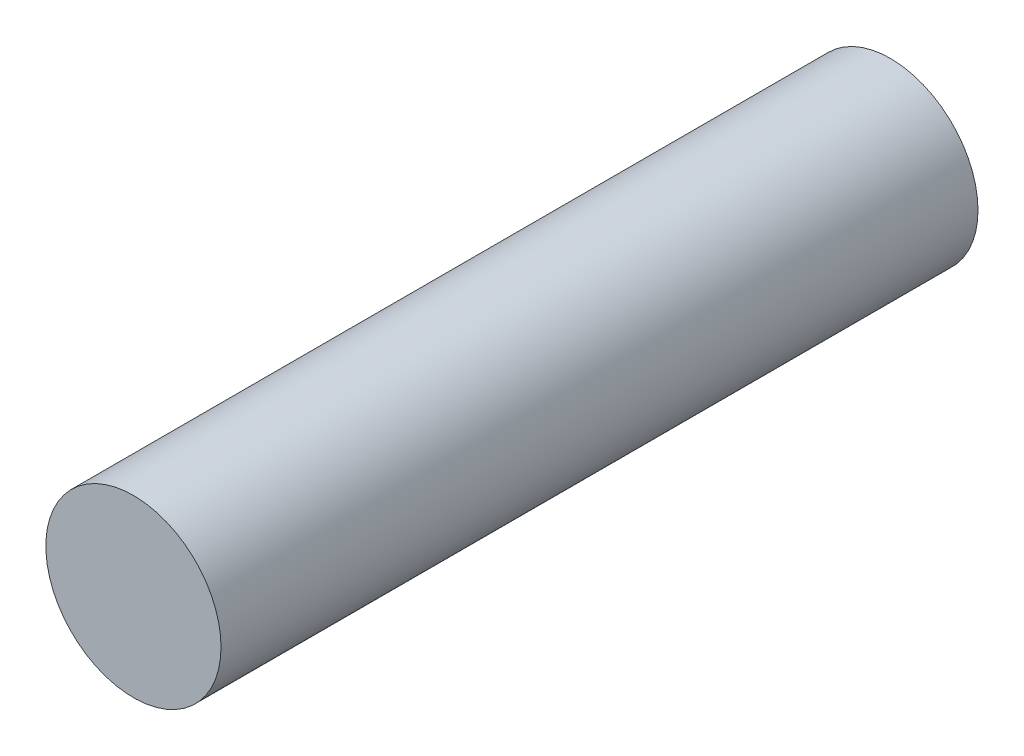
ISO-10303-21;
HEADER;
FILE_DESCRIPTION(('STEP AP214'),'2;1');
FILE_NAME('part.step','',(''),(''),'','','');
FILE_SCHEMA(('AUTOMOTIVE_DESIGN { 1 0 10303 214 1 1 1 1 }'));
ENDSEC;
DATA;
#1=APPLICATION_CONTEXT('core data for automotive mechanical design processes');
#2=APPLICATION_PROTOCOL_DEFINITION('international standard','automotive_design',2000,#1);
#3=PRODUCT_CONTEXT('',#1,'mechanical');
#4=PRODUCT('Part','Part','',(#3));
#5=PRODUCT_RELATED_PRODUCT_CATEGORY('part','',(#4));
#6=PRODUCT_DEFINITION_FORMATION('','',#4);
#7=PRODUCT_DEFINITION_CONTEXT('part definition',#1,'design');
#8=PRODUCT_DEFINITION('design','',#6,#7);
#9=PRODUCT_DEFINITION_SHAPE('','',#8);
#10=(LENGTH_UNIT() NAMED_UNIT(*) SI_UNIT(.MILLI.,.METRE.));
#11=(NAMED_UNIT(*) PLANE_ANGLE_UNIT() SI_UNIT($,.RADIAN.));
#12=(NAMED_UNIT(*) SI_UNIT($,.STERADIAN.) SOLID_ANGLE_UNIT());
#13=UNCERTAINTY_MEASURE_WITH_UNIT(LENGTH_MEASURE(1.E-05),#10,'distance_accuracy_value','');
#14=(GEOMETRIC_REPRESENTATION_CONTEXT(3) GLOBAL_UNCERTAINTY_ASSIGNED_CONTEXT((#13)) GLOBAL_UNIT_ASSIGNED_CONTEXT((#10,
#11,#12)) REPRESENTATION_CONTEXT('',''));
#15=CARTESIAN_POINT('',(0.,0.,0.));
#16=DIRECTION('',(0.,0.,1.));
#17=DIRECTION('',(1.,0.,0.));
#18=AXIS2_PLACEMENT_3D('',#15,#16,#17);
#19=CARTESIAN_POINT('',(-1.985,0.5,-2.4875));
#20=DIRECTION('',(0.,0.,1.));
#21=DIRECTION('',(1.,0.,0.));
#22=AXIS2_PLACEMENT_3D('',#19,#20,#21);
#23=PLANE('',#22);
#24=CARTESIAN_POINT('',(1.51,0.0375,-2.4875));
#25=DIRECTION('',(0.,0.,1.));
#26=DIRECTION('',(1.,0.,0.));
#27=AXIS2_PLACEMENT_3D('',#24,#25,#26);
#28=CIRCLE('',#27,0.405);
#29=CARTESIAN_POINT('',(1.915,0.0375,-2.4875));
#30=VERTEX_POINT('',#29);
#31=EDGE_CURVE('E22',#30,#30,#28,.T.);
#32=ORIENTED_EDGE('',*,*,#31,.F.);
#33=EDGE_LOOP('',(#32));
#34=FACE_BOUND('',#33,.T.);
#35=ADVANCED_FACE('F15',(#34),#23,.F.);
#36=CARTESIAN_POINT('',(1.51,0.0375,1.0125));
#37=DIRECTION('',(0.,0.,-1.));
#38=DIRECTION('',(-1.,0.,0.));
#39=AXIS2_PLACEMENT_3D('',#36,#37,#38);
#40=PLANE('',#39);
#41=CARTESIAN_POINT('',(1.51,0.0375,1.0125));
#42=DIRECTION('',(0.,0.,1.));
#43=DIRECTION('',(1.,0.,0.));
#44=AXIS2_PLACEMENT_3D('',#41,#42,#43);
#45=CIRCLE('',#44,0.405);
#46=CARTESIAN_POINT('',(1.915,0.0375,1.0125));
#47=VERTEX_POINT('',#46);
#48=EDGE_CURVE('E10',#47,#47,#45,.F.);
#49=ORIENTED_EDGE('',*,*,#48,.F.);
#50=EDGE_LOOP('',(#49));
#51=FACE_BOUND('',#50,.T.);
#52=ADVANCED_FACE('F34',(#51),#40,.F.);
#53=CARTESIAN_POINT('',(1.51,0.0375,-3.9875));
#54=DIRECTION('',(0.,0.,1.));
#55=DIRECTION('',(1.,0.,0.));
#56=AXIS2_PLACEMENT_3D('',#53,#54,#55);
#57=CYLINDRICAL_SURFACE('',#56,0.405);
#58=ORIENTED_EDGE('',*,*,#48,.T.);
#59=EDGE_LOOP('',(#58));
#60=FACE_BOUND('',#59,.T.);
#61=ORIENTED_EDGE('',*,*,#31,.T.);
#62=EDGE_LOOP('',(#61));
#63=FACE_BOUND('',#62,.T.);
#64=ADVANCED_FACE('F31',(#60,#63),#57,.T.);
#65=CLOSED_SHELL('',(#35,#52,#64));
#66=MANIFOLD_SOLID_BREP('B1',#65);
#67=ADVANCED_BREP_SHAPE_REPRESENTATION('',(#18,#66),#14);
#68=SHAPE_DEFINITION_REPRESENTATION(#9,#67);
ENDSEC;
END-ISO-10303-21;
